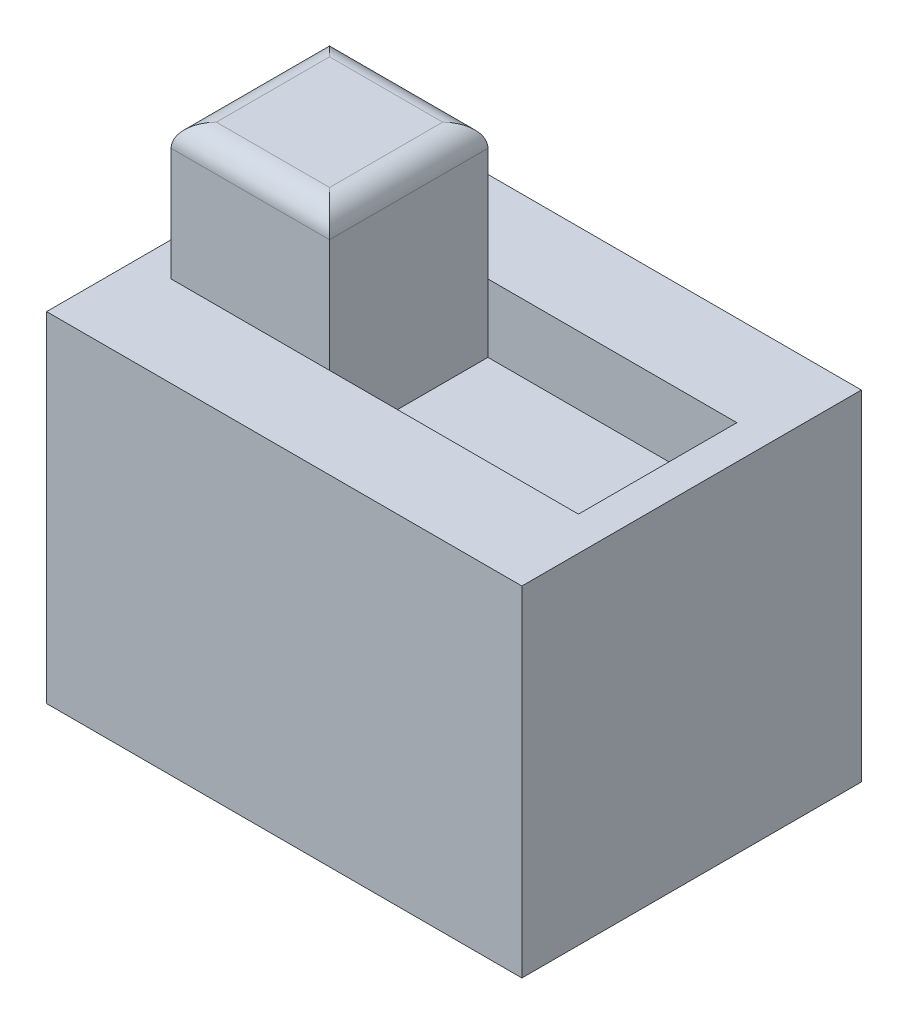
ISO-10303-21;
HEADER;
FILE_DESCRIPTION(('STEP AP214'),'2;1');
FILE_NAME('part.step','',(''),(''),'','','');
FILE_SCHEMA(('AUTOMOTIVE_DESIGN { 1 0 10303 214 1 1 1 1 }'));
ENDSEC;
DATA;
#1=APPLICATION_CONTEXT('core data for automotive mechanical design processes');
#2=APPLICATION_PROTOCOL_DEFINITION('international standard','automotive_design',2000,#1);
#3=PRODUCT_CONTEXT('',#1,'mechanical');
#4=PRODUCT('Part','Part','',(#3));
#5=PRODUCT_RELATED_PRODUCT_CATEGORY('part','',(#4));
#6=PRODUCT_DEFINITION_FORMATION('','',#4);
#7=PRODUCT_DEFINITION_CONTEXT('part definition',#1,'design');
#8=PRODUCT_DEFINITION('design','',#6,#7);
#9=PRODUCT_DEFINITION_SHAPE('','',#8);
#10=(LENGTH_UNIT() NAMED_UNIT(*) SI_UNIT(.MILLI.,.METRE.));
#11=(NAMED_UNIT(*) PLANE_ANGLE_UNIT() SI_UNIT($,.RADIAN.));
#12=(NAMED_UNIT(*) SI_UNIT($,.STERADIAN.) SOLID_ANGLE_UNIT());
#13=UNCERTAINTY_MEASURE_WITH_UNIT(LENGTH_MEASURE(1.E-05),#10,'distance_accuracy_value','');
#14=(GEOMETRIC_REPRESENTATION_CONTEXT(3) GLOBAL_UNCERTAINTY_ASSIGNED_CONTEXT((#13)) GLOBAL_UNIT_ASSIGNED_CONTEXT((#10,
#11,#12)) REPRESENTATION_CONTEXT('',''));
#15=CARTESIAN_POINT('',(0.,0.,0.));
#16=DIRECTION('',(0.,0.,1.));
#17=DIRECTION('',(1.,0.,0.));
#18=AXIS2_PLACEMENT_3D('',#15,#16,#17);
#19=CARTESIAN_POINT('',(-9.,12.,3.5));
#20=DIRECTION('',(0.,0.,1.));
#21=DIRECTION('',(1.,0.,0.));
#22=AXIS2_PLACEMENT_3D('',#19,#20,#21);
#23=PLANE('',#22);
#24=DIRECTION('',(0.,-1.,0.));
#25=VECTOR('',#24,1.);
#26=CARTESIAN_POINT('',(-2.,21.,3.5));
#27=LINE('',#26,#25);
#28=CARTESIAN_POINT('',(-2.,15.,3.5));
#29=VERTEX_POINT('',#28);
#30=CARTESIAN_POINT('',(-2.,12.,3.5));
#31=VERTEX_POINT('',#30);
#32=EDGE_CURVE('E154',#29,#31,#27,.T.);
#33=ORIENTED_EDGE('',*,*,#32,.F.);
#34=DIRECTION('',(1.,0.,0.));
#35=VECTOR('',#34,1.);
#36=CARTESIAN_POINT('',(-9.,15.,3.5));
#37=LINE('',#36,#35);
#38=CARTESIAN_POINT('',(9.,15.,3.5));
#39=VERTEX_POINT('',#38);
#40=EDGE_CURVE('E177',#29,#39,#37,.T.);
#41=ORIENTED_EDGE('',*,*,#40,.T.);
#42=DIRECTION('',(0.,1.,0.));
#43=VECTOR('',#42,1.);
#44=CARTESIAN_POINT('',(9.,12.,3.5));
#45=LINE('',#44,#43);
#46=CARTESIAN_POINT('',(9.,12.,3.5));
#47=VERTEX_POINT('',#46);
#48=EDGE_CURVE('E180',#47,#39,#45,.T.);
#49=ORIENTED_EDGE('',*,*,#48,.F.);
#50=DIRECTION('',(1.,0.,0.));
#51=VECTOR('',#50,1.);
#52=CARTESIAN_POINT('',(-9.,12.,3.5));
#53=LINE('',#52,#51);
#54=EDGE_CURVE('E140',#31,#47,#53,.T.);
#55=ORIENTED_EDGE('',*,*,#54,.F.);
#56=EDGE_LOOP('',(#33,#41,#49,#55));
#57=FACE_BOUND('',#56,.T.);
#58=ADVANCED_FACE('F34',(#57),#23,.F.);
#59=CARTESIAN_POINT('',(-9.,12.,-3.5));
#60=DIRECTION('',(0.,0.,-1.));
#61=DIRECTION('',(-1.,0.,0.));
#62=AXIS2_PLACEMENT_3D('',#59,#60,#61);
#63=PLANE('',#62);
#64=DIRECTION('',(0.,-1.,0.));
#65=VECTOR('',#64,1.);
#66=CARTESIAN_POINT('',(-2.,21.,-3.5));
#67=LINE('',#66,#65);
#68=CARTESIAN_POINT('',(-2.,15.,-3.5));
#69=VERTEX_POINT('',#68);
#70=CARTESIAN_POINT('',(-2.,12.,-3.5));
#71=VERTEX_POINT('',#70);
#72=EDGE_CURVE('E144',#69,#71,#67,.T.);
#73=ORIENTED_EDGE('',*,*,#72,.T.);
#74=DIRECTION('',(-1.,0.,0.));
#75=VECTOR('',#74,1.);
#76=CARTESIAN_POINT('',(-9.,12.,-3.5));
#77=LINE('',#76,#75);
#78=CARTESIAN_POINT('',(9.,12.,-3.5));
#79=VERTEX_POINT('',#78);
#80=EDGE_CURVE('E130',#79,#71,#77,.T.);
#81=ORIENTED_EDGE('',*,*,#80,.F.);
#82=DIRECTION('',(0.,1.,0.));
#83=VECTOR('',#82,1.);
#84=CARTESIAN_POINT('',(9.,12.,-3.5));
#85=LINE('',#84,#83);
#86=CARTESIAN_POINT('',(9.,15.,-3.5));
#87=VERTEX_POINT('',#86);
#88=EDGE_CURVE('E171',#79,#87,#85,.T.);
#89=ORIENTED_EDGE('',*,*,#88,.T.);
#90=DIRECTION('',(-1.,0.,0.));
#91=VECTOR('',#90,1.);
#92=CARTESIAN_POINT('',(-9.,15.,-3.5));
#93=LINE('',#92,#91);
#94=EDGE_CURVE('E147',#87,#69,#93,.T.);
#95=ORIENTED_EDGE('',*,*,#94,.T.);
#96=EDGE_LOOP('',(#73,#81,#89,#95));
#97=FACE_BOUND('',#96,.T.);
#98=ADVANCED_FACE('F145',(#97),#63,.F.);
#99=CARTESIAN_POINT('',(0.,12.,0.));
#100=DIRECTION('',(0.,-1.,0.));
#101=DIRECTION('',(0.,0.,-1.));
#102=AXIS2_PLACEMENT_3D('',#99,#100,#101);
#103=PLANE('',#102);
#104=DIRECTION('',(0.,0.,-1.));
#105=VECTOR('',#104,1.);
#106=CARTESIAN_POINT('',(-2.,12.,3.5));
#107=LINE('',#106,#105);
#108=EDGE_CURVE('E134',#31,#71,#107,.T.);
#109=ORIENTED_EDGE('',*,*,#108,.F.);
#110=ORIENTED_EDGE('',*,*,#54,.T.);
#111=DIRECTION('',(0.,0.,-1.));
#112=VECTOR('',#111,1.);
#113=CARTESIAN_POINT('',(9.,12.,3.5));
#114=LINE('',#113,#112);
#115=EDGE_CURVE('E137',#47,#79,#114,.T.);
#116=ORIENTED_EDGE('',*,*,#115,.T.);
#117=ORIENTED_EDGE('',*,*,#80,.T.);
#118=EDGE_LOOP('',(#109,#110,#116,#117));
#119=FACE_BOUND('',#118,.T.);
#120=ADVANCED_FACE('F132',(#119),#103,.F.);
#121=CARTESIAN_POINT('',(10.5,15.,7.5));
#122=DIRECTION('',(-1.,0.,0.));
#123=DIRECTION('',(0.,0.,1.));
#124=AXIS2_PLACEMENT_3D('',#121,#122,#123);
#125=PLANE('',#124);
#126=DIRECTION('',(0.,0.,-1.));
#127=VECTOR('',#126,1.);
#128=CARTESIAN_POINT('',(10.5,0.,7.5));
#129=LINE('',#128,#127);
#130=CARTESIAN_POINT('',(10.5,0.,7.5));
#131=VERTEX_POINT('',#130);
#132=CARTESIAN_POINT('',(10.5,0.,-7.5));
#133=VERTEX_POINT('',#132);
#134=EDGE_CURVE('E183',#131,#133,#129,.T.);
#135=ORIENTED_EDGE('',*,*,#134,.T.);
#136=DIRECTION('',(0.,-1.,0.));
#137=VECTOR('',#136,1.);
#138=CARTESIAN_POINT('',(10.5,15.,-7.5));
#139=LINE('',#138,#137);
#140=CARTESIAN_POINT('',(10.5,15.,-7.5));
#141=VERTEX_POINT('',#140);
#142=EDGE_CURVE('E211',#141,#133,#139,.T.);
#143=ORIENTED_EDGE('',*,*,#142,.F.);
#144=DIRECTION('',(0.,0.,-1.));
#145=VECTOR('',#144,1.);
#146=CARTESIAN_POINT('',(10.5,15.,7.5));
#147=LINE('',#146,#145);
#148=CARTESIAN_POINT('',(10.5,15.,7.5));
#149=VERTEX_POINT('',#148);
#150=EDGE_CURVE('E185',#149,#141,#147,.T.);
#151=ORIENTED_EDGE('',*,*,#150,.F.);
#152=DIRECTION('',(0.,-1.,0.));
#153=VECTOR('',#152,1.);
#154=CARTESIAN_POINT('',(10.5,15.,7.5));
#155=LINE('',#154,#153);
#156=EDGE_CURVE('E195',#149,#131,#155,.T.);
#157=ORIENTED_EDGE('',*,*,#156,.T.);
#158=EDGE_LOOP('',(#135,#143,#151,#157));
#159=FACE_BOUND('',#158,.T.);
#160=ADVANCED_FACE('F286',(#159),#125,.F.);
#161=CARTESIAN_POINT('',(-10.5,15.,-7.5));
#162=DIRECTION('',(0.,0.,1.));
#163=DIRECTION('',(1.,0.,0.));
#164=AXIS2_PLACEMENT_3D('',#161,#162,#163);
#165=PLANE('',#164);
#166=DIRECTION('',(-1.,0.,0.));
#167=VECTOR('',#166,1.);
#168=CARTESIAN_POINT('',(-10.5,0.,-7.5));
#169=LINE('',#168,#167);
#170=CARTESIAN_POINT('',(-10.5,0.,-7.5));
#171=VERTEX_POINT('',#170);
#172=EDGE_CURVE('E198',#133,#171,#169,.T.);
#173=ORIENTED_EDGE('',*,*,#172,.T.);
#174=DIRECTION('',(0.,-1.,0.));
#175=VECTOR('',#174,1.);
#176=CARTESIAN_POINT('',(-10.5,15.,-7.5));
#177=LINE('',#176,#175);
#178=CARTESIAN_POINT('',(-10.5,15.,-7.5));
#179=VERTEX_POINT('',#178);
#180=EDGE_CURVE('E208',#179,#171,#177,.T.);
#181=ORIENTED_EDGE('',*,*,#180,.F.);
#182=DIRECTION('',(-1.,0.,0.));
#183=VECTOR('',#182,1.);
#184=CARTESIAN_POINT('',(-10.5,15.,-7.5));
#185=LINE('',#184,#183);
#186=EDGE_CURVE('E188',#141,#179,#185,.T.);
#187=ORIENTED_EDGE('',*,*,#186,.F.);
#188=ORIENTED_EDGE('',*,*,#142,.T.);
#189=EDGE_LOOP('',(#173,#181,#187,#188));
#190=FACE_BOUND('',#189,.T.);
#191=ADVANCED_FACE('F312',(#190),#165,.F.);
#192=CARTESIAN_POINT('',(-10.5,15.,7.5));
#193=DIRECTION('',(1.,0.,0.));
#194=DIRECTION('',(0.,0.,-1.));
#195=AXIS2_PLACEMENT_3D('',#192,#193,#194);
#196=PLANE('',#195);
#197=DIRECTION('',(0.,0.,1.));
#198=VECTOR('',#197,1.);
#199=CARTESIAN_POINT('',(-10.5,0.,7.5));
#200=LINE('',#199,#198);
#201=CARTESIAN_POINT('',(-10.5,0.,7.5));
#202=VERTEX_POINT('',#201);
#203=EDGE_CURVE('E200',#171,#202,#200,.T.);
#204=ORIENTED_EDGE('',*,*,#203,.T.);
#205=DIRECTION('',(0.,-1.,0.));
#206=VECTOR('',#205,1.);
#207=CARTESIAN_POINT('',(-10.5,15.,7.5));
#208=LINE('',#207,#206);
#209=CARTESIAN_POINT('',(-10.5,15.,7.5));
#210=VERTEX_POINT('',#209);
#211=EDGE_CURVE('E205',#210,#202,#208,.T.);
#212=ORIENTED_EDGE('',*,*,#211,.F.);
#213=DIRECTION('',(0.,0.,1.));
#214=VECTOR('',#213,1.);
#215=CARTESIAN_POINT('',(-10.5,15.,7.5));
#216=LINE('',#215,#214);
#217=EDGE_CURVE('E191',#179,#210,#216,.T.);
#218=ORIENTED_EDGE('',*,*,#217,.F.);
#219=ORIENTED_EDGE('',*,*,#180,.T.);
#220=EDGE_LOOP('',(#204,#212,#218,#219));
#221=FACE_BOUND('',#220,.T.);
#222=ADVANCED_FACE('F316',(#221),#196,.F.);
#223=CARTESIAN_POINT('',(-10.5,15.,7.5));
#224=DIRECTION('',(0.,0.,-1.));
#225=DIRECTION('',(-1.,0.,0.));
#226=AXIS2_PLACEMENT_3D('',#223,#224,#225);
#227=PLANE('',#226);
#228=DIRECTION('',(1.,0.,0.));
#229=VECTOR('',#228,1.);
#230=CARTESIAN_POINT('',(-10.5,0.,7.5));
#231=LINE('',#230,#229);
#232=EDGE_CURVE('E189',#202,#131,#231,.T.);
#233=ORIENTED_EDGE('',*,*,#232,.T.);
#234=ORIENTED_EDGE('',*,*,#156,.F.);
#235=DIRECTION('',(1.,0.,0.));
#236=VECTOR('',#235,1.);
#237=CARTESIAN_POINT('',(-10.5,15.,7.5));
#238=LINE('',#237,#236);
#239=EDGE_CURVE('E193',#210,#149,#238,.T.);
#240=ORIENTED_EDGE('',*,*,#239,.F.);
#241=ORIENTED_EDGE('',*,*,#211,.T.);
#242=EDGE_LOOP('',(#233,#234,#240,#241));
#243=FACE_BOUND('',#242,.T.);
#244=ADVANCED_FACE('F320',(#243),#227,.F.);
#245=CARTESIAN_POINT('',(0.,15.,0.));
#246=DIRECTION('',(0.,-1.,0.));
#247=DIRECTION('',(0.,0.,-1.));
#248=AXIS2_PLACEMENT_3D('',#245,#246,#247);
#249=PLANE('',#248);
#250=ORIENTED_EDGE('',*,*,#94,.F.);
#251=DIRECTION('',(0.,0.,-1.));
#252=VECTOR('',#251,1.);
#253=CARTESIAN_POINT('',(9.,15.,3.5));
#254=LINE('',#253,#252);
#255=EDGE_CURVE('E167',#39,#87,#254,.T.);
#256=ORIENTED_EDGE('',*,*,#255,.F.);
#257=ORIENTED_EDGE('',*,*,#40,.F.);
#258=CARTESIAN_POINT('',(-9.,15.,3.5));
#259=VERTEX_POINT('',#258);
#260=EDGE_CURVE('E168',#259,#29,#37,.T.);
#261=ORIENTED_EDGE('',*,*,#260,.F.);
#262=DIRECTION('',(0.,0.,1.));
#263=VECTOR('',#262,1.);
#264=CARTESIAN_POINT('',(-9.,15.,3.5));
#265=LINE('',#264,#263);
#266=CARTESIAN_POINT('',(-9.,15.,-3.5));
#267=VERTEX_POINT('',#266);
#268=EDGE_CURVE('E174',#267,#259,#265,.T.);
#269=ORIENTED_EDGE('',*,*,#268,.F.);
#270=DIRECTION('',(-1.,0.,0.));
#271=VECTOR('',#270,1.);
#272=CARTESIAN_POINT('',(0.,15.,-3.5));
#273=LINE('',#272,#271);
#274=EDGE_CURVE('E164',#69,#267,#273,.T.);
#275=ORIENTED_EDGE('',*,*,#274,.F.);
#276=EDGE_LOOP('',(#250,#256,#257,#261,#269,#275));
#277=FACE_BOUND('',#276,.T.);
#278=ORIENTED_EDGE('',*,*,#150,.T.);
#279=ORIENTED_EDGE('',*,*,#186,.T.);
#280=ORIENTED_EDGE('',*,*,#217,.T.);
#281=ORIENTED_EDGE('',*,*,#239,.T.);
#282=EDGE_LOOP('',(#278,#279,#280,#281));
#283=FACE_BOUND('',#282,.T.);
#284=ADVANCED_FACE('F258',(#277,#283),#249,.F.);
#285=CARTESIAN_POINT('',(0.,0.,0.));
#286=DIRECTION('',(0.,-1.,0.));
#287=DIRECTION('',(0.,0.,-1.));
#288=AXIS2_PLACEMENT_3D('',#285,#286,#287);
#289=PLANE('',#288);
#290=ORIENTED_EDGE('',*,*,#134,.F.);
#291=ORIENTED_EDGE('',*,*,#232,.F.);
#292=ORIENTED_EDGE('',*,*,#203,.F.);
#293=ORIENTED_EDGE('',*,*,#172,.F.);
#294=EDGE_LOOP('',(#290,#291,#292,#293));
#295=FACE_BOUND('',#294,.T.);
#296=ADVANCED_FACE('F268',(#295),#289,.T.);
#297=CARTESIAN_POINT('',(9.,12.,3.5));
#298=DIRECTION('',(1.,0.,0.));
#299=DIRECTION('',(0.,0.,-1.));
#300=AXIS2_PLACEMENT_3D('',#297,#298,#299);
#301=PLANE('',#300);
#302=ORIENTED_EDGE('',*,*,#255,.T.);
#303=ORIENTED_EDGE('',*,*,#88,.F.);
#304=ORIENTED_EDGE('',*,*,#115,.F.);
#305=ORIENTED_EDGE('',*,*,#48,.T.);
#306=EDGE_LOOP('',(#302,#303,#304,#305));
#307=FACE_BOUND('',#306,.T.);
#308=ADVANCED_FACE('F266',(#307),#301,.F.);
#309=CARTESIAN_POINT('',(-9.,21.,3.5));
#310=DIRECTION('',(1.,0.,0.));
#311=DIRECTION('',(0.,0.,-1.));
#312=AXIS2_PLACEMENT_3D('',#309,#310,#311);
#313=PLANE('',#312);
#314=DIRECTION('',(0.,-1.,0.));
#315=VECTOR('',#314,1.);
#316=CARTESIAN_POINT('',(-9.,21.,3.5));
#317=LINE('',#316,#315);
#318=CARTESIAN_POINT('',(-9.,20.,3.5));
#319=VERTEX_POINT('',#318);
#320=EDGE_CURVE('E162',#319,#259,#317,.T.);
#321=ORIENTED_EDGE('',*,*,#320,.F.);
#322=DIRECTION('',(0.,0.,1.));
#323=VECTOR('',#322,1.);
#324=CARTESIAN_POINT('',(-9.,20.,3.5));
#325=LINE('',#324,#323);
#326=CARTESIAN_POINT('',(-9.,20.,-3.5));
#327=VERTEX_POINT('',#326);
#328=EDGE_CURVE('E11',#319,#327,#325,.F.);
#329=ORIENTED_EDGE('',*,*,#328,.T.);
#330=DIRECTION('',(0.,-1.,0.));
#331=VECTOR('',#330,1.);
#332=CARTESIAN_POINT('',(-9.,21.,-3.5));
#333=LINE('',#332,#331);
#334=EDGE_CURVE('E149',#327,#267,#333,.T.);
#335=ORIENTED_EDGE('',*,*,#334,.T.);
#336=ORIENTED_EDGE('',*,*,#268,.T.);
#337=EDGE_LOOP('',(#321,#329,#335,#336));
#338=FACE_BOUND('',#337,.T.);
#339=ADVANCED_FACE('F255',(#338),#313,.F.);
#340=CARTESIAN_POINT('',(-9.,21.,3.5));
#341=DIRECTION('',(0.,0.,-1.));
#342=DIRECTION('',(-1.,0.,0.));
#343=AXIS2_PLACEMENT_3D('',#340,#341,#342);
#344=PLANE('',#343);
#345=CARTESIAN_POINT('',(-2.,20.,3.5));
#346=VERTEX_POINT('',#345);
#347=EDGE_CURVE('E160',#346,#29,#27,.T.);
#348=ORIENTED_EDGE('',*,*,#347,.F.);
#349=DIRECTION('',(1.,0.,0.));
#350=VECTOR('',#349,1.);
#351=CARTESIAN_POINT('',(-9.,20.,3.5));
#352=LINE('',#351,#350);
#353=EDGE_CURVE('E43',#346,#319,#352,.F.);
#354=ORIENTED_EDGE('',*,*,#353,.T.);
#355=ORIENTED_EDGE('',*,*,#320,.T.);
#356=ORIENTED_EDGE('',*,*,#260,.T.);
#357=EDGE_LOOP('',(#348,#354,#355,#356));
#358=FACE_BOUND('',#357,.T.);
#359=ADVANCED_FACE('F262',(#358),#344,.F.);
#360=CARTESIAN_POINT('',(-9.,21.,-3.5));
#361=DIRECTION('',(0.,0.,1.));
#362=DIRECTION('',(1.,0.,0.));
#363=AXIS2_PLACEMENT_3D('',#360,#361,#362);
#364=PLANE('',#363);
#365=ORIENTED_EDGE('',*,*,#334,.F.);
#366=DIRECTION('',(-1.,0.,0.));
#367=VECTOR('',#366,1.);
#368=CARTESIAN_POINT('',(-9.,20.,-3.5));
#369=LINE('',#368,#367);
#370=CARTESIAN_POINT('',(-2.,20.,-3.5));
#371=VERTEX_POINT('',#370);
#372=EDGE_CURVE('E223',#327,#371,#369,.F.);
#373=ORIENTED_EDGE('',*,*,#372,.T.);
#374=EDGE_CURVE('E148',#371,#69,#67,.T.);
#375=ORIENTED_EDGE('',*,*,#374,.T.);
#376=ORIENTED_EDGE('',*,*,#274,.T.);
#377=EDGE_LOOP('',(#365,#373,#375,#376));
#378=FACE_BOUND('',#377,.T.);
#379=ADVANCED_FACE('F251',(#378),#364,.F.);
#380=CARTESIAN_POINT('',(-2.,21.,3.5));
#381=DIRECTION('',(-1.,0.,0.));
#382=DIRECTION('',(0.,0.,1.));
#383=AXIS2_PLACEMENT_3D('',#380,#381,#382);
#384=PLANE('',#383);
#385=ORIENTED_EDGE('',*,*,#374,.F.);
#386=DIRECTION('',(0.,0.,-1.));
#387=VECTOR('',#386,1.);
#388=CARTESIAN_POINT('',(-2.,20.,3.5));
#389=LINE('',#388,#387);
#390=EDGE_CURVE('E58',#371,#346,#389,.F.);
#391=ORIENTED_EDGE('',*,*,#390,.T.);
#392=ORIENTED_EDGE('',*,*,#347,.T.);
#393=ORIENTED_EDGE('',*,*,#32,.T.);
#394=ORIENTED_EDGE('',*,*,#108,.T.);
#395=ORIENTED_EDGE('',*,*,#72,.F.);
#396=EDGE_LOOP('',(#385,#391,#392,#393,#394,#395));
#397=FACE_BOUND('',#396,.T.);
#398=ADVANCED_FACE('F152',(#397),#384,.F.);
#399=CARTESIAN_POINT('',(0.,21.,0.));
#400=DIRECTION('',(0.,-1.,0.));
#401=DIRECTION('',(0.,0.,-1.));
#402=AXIS2_PLACEMENT_3D('',#399,#400,#401);
#403=PLANE('',#402);
#404=DIRECTION('',(0.,0.,-1.));
#405=VECTOR('',#404,1.);
#406=CARTESIAN_POINT('',(-3.,21.,0.));
#407=LINE('',#406,#405);
#408=CARTESIAN_POINT('',(-3.,21.,2.5));
#409=VERTEX_POINT('',#408);
#410=CARTESIAN_POINT('',(-3.,21.,-2.5));
#411=VERTEX_POINT('',#410);
#412=EDGE_CURVE('E218',#409,#411,#407,.T.);
#413=ORIENTED_EDGE('',*,*,#412,.T.);
#414=DIRECTION('',(-1.,0.,0.));
#415=VECTOR('',#414,1.);
#416=CARTESIAN_POINT('',(0.,21.,-2.5));
#417=LINE('',#416,#415);
#418=CARTESIAN_POINT('',(-8.,21.,-2.5));
#419=VERTEX_POINT('',#418);
#420=EDGE_CURVE('E220',#411,#419,#417,.T.);
#421=ORIENTED_EDGE('',*,*,#420,.T.);
#422=DIRECTION('',(0.,0.,1.));
#423=VECTOR('',#422,1.);
#424=CARTESIAN_POINT('',(-8.,21.,0.));
#425=LINE('',#424,#423);
#426=CARTESIAN_POINT('',(-8.,21.,2.5));
#427=VERTEX_POINT('',#426);
#428=EDGE_CURVE('E214',#419,#427,#425,.T.);
#429=ORIENTED_EDGE('',*,*,#428,.T.);
#430=DIRECTION('',(1.,0.,0.));
#431=VECTOR('',#430,1.);
#432=CARTESIAN_POINT('',(0.,21.,2.5));
#433=LINE('',#432,#431);
#434=EDGE_CURVE('E216',#427,#409,#433,.T.);
#435=ORIENTED_EDGE('',*,*,#434,.T.);
#436=EDGE_LOOP('',(#413,#421,#429,#435));
#437=FACE_BOUND('',#436,.T.);
#438=ADVANCED_FACE('F243',(#437),#403,.F.);
#439=CARTESIAN_POINT('',(0.,20.,2.5));
#440=DIRECTION('',(1.,0.,0.));
#441=DIRECTION('',(0.,0.,-1.));
#442=AXIS2_PLACEMENT_3D('',#439,#440,#441);
#443=CYLINDRICAL_SURFACE('',#442,1.);
#444=CARTESIAN_POINT('',(-8.,20.,2.5));
#445=DIRECTION('',(0.707106781186547,0.,0.707106781186547));
#446=DIRECTION('',(-0.707106781186547,0.,0.707106781186547));
#447=AXIS2_PLACEMENT_3D('',#444,#445,#446);
#448=ELLIPSE('',#447,1.41421356237309,1.);
#449=EDGE_CURVE('E158',#319,#427,#448,.F.);
#450=ORIENTED_EDGE('',*,*,#449,.F.);
#451=ORIENTED_EDGE('',*,*,#353,.F.);
#452=CARTESIAN_POINT('',(-3.,20.,2.5));
#453=DIRECTION('',(0.707106781186547,0.,-0.707106781186547));
#454=DIRECTION('',(0.707106781186547,0.,0.707106781186547));
#455=AXIS2_PLACEMENT_3D('',#452,#453,#454);
#456=ELLIPSE('',#455,1.41421356237309,1.);
#457=EDGE_CURVE('E38',#409,#346,#456,.T.);
#458=ORIENTED_EDGE('',*,*,#457,.F.);
#459=ORIENTED_EDGE('',*,*,#434,.F.);
#460=EDGE_LOOP('',(#450,#451,#458,#459));
#461=FACE_BOUND('',#460,.T.);
#462=ADVANCED_FACE('F36',(#461),#443,.T.);
#463=CARTESIAN_POINT('',(-3.,20.,0.));
#464=DIRECTION('',(0.,0.,-1.));
#465=DIRECTION('',(-1.,0.,0.));
#466=AXIS2_PLACEMENT_3D('',#463,#464,#465);
#467=CYLINDRICAL_SURFACE('',#466,1.);
#468=ORIENTED_EDGE('',*,*,#457,.T.);
#469=ORIENTED_EDGE('',*,*,#390,.F.);
#470=CARTESIAN_POINT('',(-3.,20.,-2.5));
#471=DIRECTION('',(-0.707106781186547,0.,-0.707106781186547));
#472=DIRECTION('',(0.707106781186547,0.,-0.707106781186547));
#473=AXIS2_PLACEMENT_3D('',#470,#471,#472);
#474=ELLIPSE('',#473,1.41421356237309,1.);
#475=EDGE_CURVE('E230',#411,#371,#474,.T.);
#476=ORIENTED_EDGE('',*,*,#475,.F.);
#477=ORIENTED_EDGE('',*,*,#412,.F.);
#478=EDGE_LOOP('',(#468,#469,#476,#477));
#479=FACE_BOUND('',#478,.T.);
#480=ADVANCED_FACE('F298',(#479),#467,.T.);
#481=CARTESIAN_POINT('',(-8.,20.,0.));
#482=DIRECTION('',(0.,0.,1.));
#483=DIRECTION('',(1.,0.,0.));
#484=AXIS2_PLACEMENT_3D('',#481,#482,#483);
#485=CYLINDRICAL_SURFACE('',#484,1.);
#486=ORIENTED_EDGE('',*,*,#449,.T.);
#487=ORIENTED_EDGE('',*,*,#428,.F.);
#488=CARTESIAN_POINT('',(-8.,20.,-2.5));
#489=DIRECTION('',(-0.707106781186547,0.,0.707106781186547));
#490=DIRECTION('',(0.707106781186547,0.,0.707106781186547));
#491=AXIS2_PLACEMENT_3D('',#488,#489,#490);
#492=ELLIPSE('',#491,1.41421356237309,1.);
#493=EDGE_CURVE('E228',#327,#419,#492,.F.);
#494=ORIENTED_EDGE('',*,*,#493,.F.);
#495=ORIENTED_EDGE('',*,*,#328,.F.);
#496=EDGE_LOOP('',(#486,#487,#494,#495));
#497=FACE_BOUND('',#496,.T.);
#498=ADVANCED_FACE('F236',(#497),#485,.T.);
#499=CARTESIAN_POINT('',(0.,20.,-2.5));
#500=DIRECTION('',(-1.,0.,0.));
#501=DIRECTION('',(0.,0.,1.));
#502=AXIS2_PLACEMENT_3D('',#499,#500,#501);
#503=CYLINDRICAL_SURFACE('',#502,1.);
#504=ORIENTED_EDGE('',*,*,#475,.T.);
#505=ORIENTED_EDGE('',*,*,#372,.F.);
#506=ORIENTED_EDGE('',*,*,#493,.T.);
#507=ORIENTED_EDGE('',*,*,#420,.F.);
#508=EDGE_LOOP('',(#504,#505,#506,#507));
#509=FACE_BOUND('',#508,.T.);
#510=ADVANCED_FACE('F247',(#509),#503,.T.);
#511=CLOSED_SHELL('',(#58,#98,#120,#160,#191,#222,#244,#284,#296,#308,#339,#359,#379,#398,#438,
#462,#480,#498,#510));
#512=MANIFOLD_SOLID_BREP('B2',#511);
#513=ADVANCED_BREP_SHAPE_REPRESENTATION('',(#18,#512),#14);
#514=SHAPE_DEFINITION_REPRESENTATION(#9,#513);
ENDSEC;
END-ISO-10303-21;
